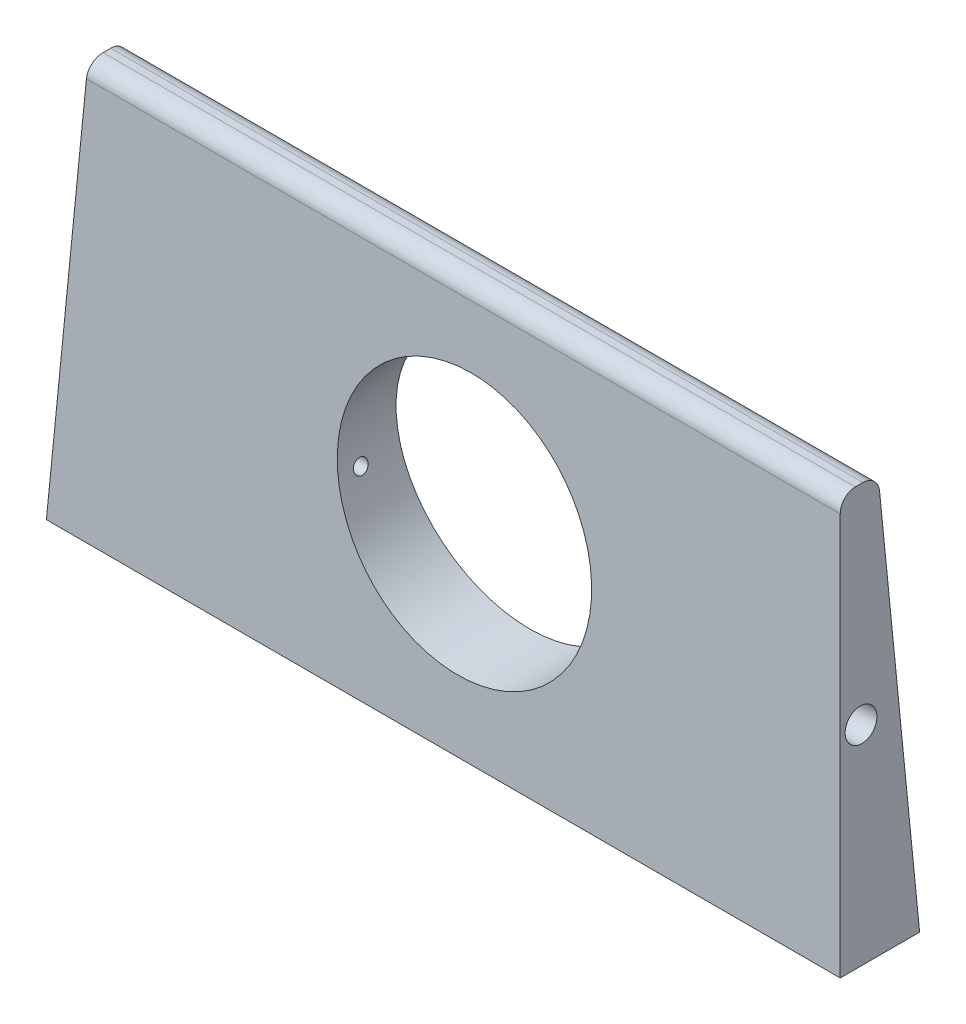
ISO-10303-21;
HEADER;
FILE_DESCRIPTION(('STEP AP214'),'2;1');
FILE_NAME('part.step','',(''),(''),'','','');
FILE_SCHEMA(('AUTOMOTIVE_DESIGN { 1 0 10303 214 1 1 1 1 }'));
ENDSEC;
DATA;
#1=APPLICATION_CONTEXT('core data for automotive mechanical design processes');
#2=APPLICATION_PROTOCOL_DEFINITION('international standard','automotive_design',2000,#1);
#3=PRODUCT_CONTEXT('',#1,'mechanical');
#4=PRODUCT('Part','Part','',(#3));
#5=PRODUCT_RELATED_PRODUCT_CATEGORY('part','',(#4));
#6=PRODUCT_DEFINITION_FORMATION('','',#4);
#7=PRODUCT_DEFINITION_CONTEXT('part definition',#1,'design');
#8=PRODUCT_DEFINITION('design','',#6,#7);
#9=PRODUCT_DEFINITION_SHAPE('','',#8);
#10=(LENGTH_UNIT() NAMED_UNIT(*) SI_UNIT(.MILLI.,.METRE.));
#11=(NAMED_UNIT(*) PLANE_ANGLE_UNIT() SI_UNIT($,.RADIAN.));
#12=(NAMED_UNIT(*) SI_UNIT($,.STERADIAN.) SOLID_ANGLE_UNIT());
#13=UNCERTAINTY_MEASURE_WITH_UNIT(LENGTH_MEASURE(1.E-05),#10,'distance_accuracy_value','');
#14=(GEOMETRIC_REPRESENTATION_CONTEXT(3) GLOBAL_UNCERTAINTY_ASSIGNED_CONTEXT((#13)) GLOBAL_UNIT_ASSIGNED_CONTEXT((#10,
#11,#12)) REPRESENTATION_CONTEXT('',''));
#15=CARTESIAN_POINT('',(0.,0.,0.));
#16=DIRECTION('',(0.,0.,1.));
#17=DIRECTION('',(1.,0.,0.));
#18=AXIS2_PLACEMENT_3D('',#15,#16,#17);
#19=CARTESIAN_POINT('',(50.,0.,-5.));
#20=DIRECTION('',(0.998629534754574,0.0523359562429438,0.));
#21=DIRECTION('',(-0.0523359562429439,0.998629534754574,0.));
#22=AXIS2_PLACEMENT_3D('',#19,#20,#21);
#23=PLANE('',#22);
#24=CARTESIAN_POINT('',(48.689805517924,25.,1.06767845664397));
#25=DIRECTION('',(0.998629534754574,0.0523359562429439,0.));
#26=DIRECTION('',(-0.0523359562429439,0.998629534754574,0.));
#27=AXIS2_PLACEMENT_3D('',#24,#25,#26);
#28=CIRCLE('',#27,2.);
#29=CARTESIAN_POINT('',(48.5851336054381,26.9972590695092,1.06767845664397));
#30=VERTEX_POINT('',#29);
#31=EDGE_CURVE('E148',#30,#30,#28,.T.);
#32=ORIENTED_EDGE('',*,*,#31,.F.);
#33=EDGE_LOOP('',(#32));
#34=FACE_BOUND('',#33,.T.);
#35=DIRECTION('',(0.0522644276887139,-0.997264688634237,-0.0522644276887139));
#36=VECTOR('',#35,1.);
#37=CARTESIAN_POINT('',(49.7268429598371,5.21214682056319,-4.72684295983712));
#38=LINE('',#37,#36);
#39=CARTESIAN_POINT('',(47.4789409719273,48.1046719124859,-2.47894097192733));
#40=VERTEX_POINT('',#39);
#41=CARTESIAN_POINT('',(50.,0.,-5.));
#42=VERTEX_POINT('',#41);
#43=EDGE_CURVE('E91',#40,#42,#38,.T.);
#44=ORIENTED_EDGE('',*,*,#43,.F.);
#45=CARTESIAN_POINT('',(47.484426594414,48.,-0.48168190241818));
#46=DIRECTION('',(0.998629534754574,0.0523359562429438,0.));
#47=DIRECTION('',(-0.0523359562429439,0.998629534754574,0.));
#48=AXIS2_PLACEMENT_3D('',#45,#46,#47);
#49=ELLIPSE('',#48,2.00274469199584,2.);
#50=CARTESIAN_POINT('',(47.379611035848,50.,-0.481681902418181));
#51=VERTEX_POINT('',#50);
#52=EDGE_CURVE('E47',#40,#51,#49,.T.);
#53=ORIENTED_EDGE('',*,*,#52,.T.);
#54=DIRECTION('',(0.,0.,1.));
#55=VECTOR('',#54,1.);
#56=CARTESIAN_POINT('',(47.379611035848,50.,-5.));
#57=LINE('',#56,#55);
#58=CARTESIAN_POINT('',(47.379611035848,50.,0.481681902418181));
#59=VERTEX_POINT('',#58);
#60=EDGE_CURVE('E121',#59,#51,#57,.F.);
#61=ORIENTED_EDGE('',*,*,#60,.F.);
#62=CARTESIAN_POINT('',(47.484426594414,48.,0.481681902418183));
#63=DIRECTION('',(0.998629534754574,0.0523359562429438,0.));
#64=DIRECTION('',(0.0523359562429439,-0.998629534754574,0.));
#65=AXIS2_PLACEMENT_3D('',#62,#63,#64);
#66=ELLIPSE('',#65,2.00274469199584,2.);
#67=CARTESIAN_POINT('',(47.4789409719273,48.1046719124859,2.47894097192733));
#68=VERTEX_POINT('',#67);
#69=EDGE_CURVE('E55',#59,#68,#66,.T.);
#70=ORIENTED_EDGE('',*,*,#69,.T.);
#71=DIRECTION('',(0.0522644276887139,-0.997264688634237,0.0522644276887139));
#72=VECTOR('',#71,1.);
#73=CARTESIAN_POINT('',(49.9726842959837,0.521214682056319,4.97268429598371));
#74=LINE('',#73,#72);
#75=CARTESIAN_POINT('',(50.,0.,5.));
#76=VERTEX_POINT('',#75);
#77=EDGE_CURVE('E109',#68,#76,#74,.T.);
#78=ORIENTED_EDGE('',*,*,#77,.T.);
#79=DIRECTION('',(0.,0.,-1.));
#80=VECTOR('',#79,1.);
#81=CARTESIAN_POINT('',(50.,0.,-5.));
#82=LINE('',#81,#80);
#83=EDGE_CURVE('E105',#76,#42,#82,.T.);
#84=ORIENTED_EDGE('',*,*,#83,.T.);
#85=EDGE_LOOP('',(#44,#53,#61,#70,#78,#84));
#86=FACE_BOUND('',#85,.T.);
#87=ADVANCED_FACE('F33',(#34,#86),#23,.T.);
#88=CARTESIAN_POINT('',(-50.,0.,-5.));
#89=DIRECTION('',(0.,0.0523359562429438,-0.998629534754574));
#90=DIRECTION('',(0.,0.998629534754574,0.0523359562429439));
#91=AXIS2_PLACEMENT_3D('',#88,#89,#90);
#92=PLANE('',#91);
#93=CARTESIAN_POINT('',(1.37682838803018,24.9657383688644,-3.69160109392641));
#94=DIRECTION('',(0.,0.0523359562429439,-0.998629534754574));
#95=DIRECTION('',(0.,0.998629534754574,0.0523359562429439));
#96=AXIS2_PLACEMENT_3D('',#93,#94,#95);
#97=CIRCLE('',#96,16.);
#98=CARTESIAN_POINT('',(1.37682838803018,40.9438109249375,-2.8542257940393));
#99=VERTEX_POINT('',#98);
#100=EDGE_CURVE('E114',#99,#99,#97,.T.);
#101=ORIENTED_EDGE('',*,*,#100,.F.);
#102=EDGE_LOOP('',(#101));
#103=FACE_BOUND('',#102,.T.);
#104=DIRECTION('',(-0.052264427688714,-0.997264688634237,-0.0522644276887139));
#105=VECTOR('',#104,1.);
#106=CARTESIAN_POINT('',(-50.,0.,-5.));
#107=LINE('',#106,#105);
#108=CARTESIAN_POINT('',(-47.4789409719273,48.1046719124859,-2.47894097192733));
#109=VERTEX_POINT('',#108);
#110=CARTESIAN_POINT('',(-50.,0.,-5.));
#111=VERTEX_POINT('',#110);
#112=EDGE_CURVE('E99',#109,#111,#107,.T.);
#113=ORIENTED_EDGE('',*,*,#112,.F.);
#114=DIRECTION('',(-1.,0.,0.));
#115=VECTOR('',#114,1.);
#116=CARTESIAN_POINT('',(47.3796110358479,48.1046719124859,-2.47894097192733));
#117=LINE('',#116,#115);
#118=EDGE_CURVE('E63',#109,#40,#117,.F.);
#119=ORIENTED_EDGE('',*,*,#118,.T.);
#120=ORIENTED_EDGE('',*,*,#43,.T.);
#121=DIRECTION('',(-1.,0.,0.));
#122=VECTOR('',#121,1.);
#123=CARTESIAN_POINT('',(-50.,0.,-5.));
#124=LINE('',#123,#122);
#125=EDGE_CURVE('E94',#42,#111,#124,.T.);
#126=ORIENTED_EDGE('',*,*,#125,.T.);
#127=EDGE_LOOP('',(#113,#119,#120,#126));
#128=FACE_BOUND('',#127,.T.);
#129=ADVANCED_FACE('F93',(#103,#128),#92,.T.);
#130=CARTESIAN_POINT('',(-50.,0.,-5.));
#131=DIRECTION('',(-0.998629534754574,0.0523359562429438,0.));
#132=DIRECTION('',(-0.0523359562429439,-0.998629534754574,0.));
#133=AXIS2_PLACEMENT_3D('',#130,#131,#132);
#134=PLANE('',#133);
#135=CARTESIAN_POINT('',(-48.9579742705038,19.8830353766459,1.06767845664397));
#136=DIRECTION('',(-0.998629534754574,0.0523359562429438,0.));
#137=DIRECTION('',(0.0523359562429438,0.998629534754574,0.));
#138=AXIS2_PLACEMENT_3D('',#135,#136,#137);
#139=ELLIPSE('',#138,0.29482816245339,0.293212569488019);
#140=CARTESIAN_POINT('',(-48.9425441566945,20.1774594873492,1.06767845664397));
#141=VERTEX_POINT('',#140);
#142=EDGE_CURVE('E271',#141,#141,#139,.F.);
#143=ORIENTED_EDGE('',*,*,#142,.T.);
#144=EDGE_LOOP('',(#143));
#145=FACE_BOUND('',#144,.T.);
#146=DIRECTION('',(0.,0.,-1.));
#147=VECTOR('',#146,1.);
#148=CARTESIAN_POINT('',(-47.3796110358479,50.,-5.));
#149=LINE('',#148,#147);
#150=CARTESIAN_POINT('',(-47.3796110358479,50.,-0.481681902418181));
#151=VERTEX_POINT('',#150);
#152=CARTESIAN_POINT('',(-47.3796110358479,50.,0.481681902418181));
#153=VERTEX_POINT('',#152);
#154=EDGE_CURVE('E125',#151,#153,#149,.F.);
#155=ORIENTED_EDGE('',*,*,#154,.F.);
#156=CARTESIAN_POINT('',(-47.484426594414,48.,-0.48168190241818));
#157=DIRECTION('',(-0.998629534754574,0.0523359562429438,0.));
#158=DIRECTION('',(-0.0523359562429439,-0.998629534754574,0.));
#159=AXIS2_PLACEMENT_3D('',#156,#157,#158);
#160=ELLIPSE('',#159,2.00274469199584,2.);
#161=EDGE_CURVE('E139',#151,#109,#160,.T.);
#162=ORIENTED_EDGE('',*,*,#161,.T.);
#163=ORIENTED_EDGE('',*,*,#112,.T.);
#164=DIRECTION('',(0.,0.,1.));
#165=VECTOR('',#164,1.);
#166=CARTESIAN_POINT('',(-50.,0.,-5.));
#167=LINE('',#166,#165);
#168=CARTESIAN_POINT('',(-50.,0.,5.));
#169=VERTEX_POINT('',#168);
#170=EDGE_CURVE('E107',#111,#169,#167,.T.);
#171=ORIENTED_EDGE('',*,*,#170,.T.);
#172=DIRECTION('',(-0.0522644276887139,-0.997264688634237,0.0522644276887139));
#173=VECTOR('',#172,1.);
#174=CARTESIAN_POINT('',(-50.,0.,5.));
#175=LINE('',#174,#173);
#176=CARTESIAN_POINT('',(-47.4789409719273,48.1046719124859,2.47894097192733));
#177=VERTEX_POINT('',#176);
#178=EDGE_CURVE('E124',#177,#169,#175,.T.);
#179=ORIENTED_EDGE('',*,*,#178,.F.);
#180=CARTESIAN_POINT('',(-47.484426594414,48.,0.481681902418183));
#181=DIRECTION('',(-0.998629534754574,0.0523359562429438,0.));
#182=DIRECTION('',(0.0523359562429439,0.998629534754574,0.));
#183=AXIS2_PLACEMENT_3D('',#180,#181,#182);
#184=ELLIPSE('',#183,2.00274469199584,2.);
#185=EDGE_CURVE('E137',#177,#153,#184,.T.);
#186=ORIENTED_EDGE('',*,*,#185,.T.);
#187=EDGE_LOOP('',(#155,#162,#163,#171,#179,#186));
#188=FACE_BOUND('',#187,.T.);
#189=ADVANCED_FACE('F170',(#145,#188),#134,.T.);
#190=CARTESIAN_POINT('',(-50.,0.,5.));
#191=DIRECTION('',(0.,0.0523359562429438,0.998629534754574));
#192=DIRECTION('',(0.,-0.998629534754574,0.0523359562429439));
#193=AXIS2_PLACEMENT_3D('',#190,#191,#192);
#194=PLANE('',#193);
#195=CARTESIAN_POINT('',(1.37682838803018,24.5777354589813,3.71193546478874));
#196=DIRECTION('',(0.,0.0523359562429438,0.998629534754574));
#197=DIRECTION('',(0.,0.998629534754574,-0.0523359562429439));
#198=AXIS2_PLACEMENT_3D('',#195,#196,#197);
#199=ELLIPSE('',#198,16.0881324730163,16.);
#200=CARTESIAN_POINT('',(1.37682838803018,40.6438197055795,2.86994766765027));
#201=VERTEX_POINT('',#200);
#202=EDGE_CURVE('E111',#201,#201,#199,.F.);
#203=ORIENTED_EDGE('',*,*,#202,.T.);
#204=EDGE_LOOP('',(#203));
#205=FACE_BOUND('',#204,.T.);
#206=ORIENTED_EDGE('',*,*,#77,.F.);
#207=DIRECTION('',(1.,0.,0.));
#208=VECTOR('',#207,1.);
#209=CARTESIAN_POINT('',(-47.3796110358479,48.1046719124859,2.47894097192733));
#210=LINE('',#209,#208);
#211=EDGE_CURVE('E11',#68,#177,#210,.F.);
#212=ORIENTED_EDGE('',*,*,#211,.T.);
#213=ORIENTED_EDGE('',*,*,#178,.T.);
#214=DIRECTION('',(1.,0.,0.));
#215=VECTOR('',#214,1.);
#216=CARTESIAN_POINT('',(-50.,0.,5.));
#217=LINE('',#216,#215);
#218=EDGE_CURVE('E120',#169,#76,#217,.T.);
#219=ORIENTED_EDGE('',*,*,#218,.T.);
#220=EDGE_LOOP('',(#206,#212,#213,#219));
#221=FACE_BOUND('',#220,.T.);
#222=ADVANCED_FACE('F176',(#205,#221),#194,.T.);
#223=CARTESIAN_POINT('',(0.,50.,0.));
#224=DIRECTION('',(0.,1.,0.));
#225=DIRECTION('',(0.,0.,1.));
#226=AXIS2_PLACEMENT_3D('',#223,#224,#225);
#227=PLANE('',#226);
#228=ORIENTED_EDGE('',*,*,#60,.T.);
#229=DIRECTION('',(1.,0.,0.));
#230=VECTOR('',#229,1.);
#231=CARTESIAN_POINT('',(-47.3796110358479,50.,-0.48168190241818));
#232=LINE('',#231,#230);
#233=EDGE_CURVE('E134',#51,#151,#232,.F.);
#234=ORIENTED_EDGE('',*,*,#233,.T.);
#235=ORIENTED_EDGE('',*,*,#154,.T.);
#236=DIRECTION('',(-1.,0.,0.));
#237=VECTOR('',#236,1.);
#238=CARTESIAN_POINT('',(47.3796110358479,50.,0.481681902418183));
#239=LINE('',#238,#237);
#240=EDGE_CURVE('E98',#153,#59,#239,.F.);
#241=ORIENTED_EDGE('',*,*,#240,.T.);
#242=EDGE_LOOP('',(#228,#234,#235,#241));
#243=FACE_BOUND('',#242,.T.);
#244=ADVANCED_FACE('F179',(#243),#227,.T.);
#245=CARTESIAN_POINT('',(0.,0.,0.));
#246=DIRECTION('',(0.,1.,0.));
#247=DIRECTION('',(0.,0.,1.));
#248=AXIS2_PLACEMENT_3D('',#245,#246,#247);
#249=PLANE('',#248);
#250=ORIENTED_EDGE('',*,*,#83,.F.);
#251=ORIENTED_EDGE('',*,*,#218,.F.);
#252=ORIENTED_EDGE('',*,*,#170,.F.);
#253=ORIENTED_EDGE('',*,*,#125,.F.);
#254=EDGE_LOOP('',(#250,#251,#252,#253));
#255=FACE_BOUND('',#254,.T.);
#256=ADVANCED_FACE('F103',(#255),#249,.F.);
#257=CARTESIAN_POINT('',(0.,48.,-0.48168190241818));
#258=DIRECTION('',(-1.,0.,0.));
#259=DIRECTION('',(0.,0.,1.));
#260=AXIS2_PLACEMENT_3D('',#257,#258,#259);
#261=CYLINDRICAL_SURFACE('',#260,2.);
#262=ORIENTED_EDGE('',*,*,#52,.F.);
#263=ORIENTED_EDGE('',*,*,#118,.F.);
#264=ORIENTED_EDGE('',*,*,#161,.F.);
#265=ORIENTED_EDGE('',*,*,#233,.F.);
#266=EDGE_LOOP('',(#262,#263,#264,#265));
#267=FACE_BOUND('',#266,.T.);
#268=ADVANCED_FACE('F183',(#267),#261,.T.);
#269=CARTESIAN_POINT('',(0.,48.,0.481681902418183));
#270=DIRECTION('',(1.,0.,0.));
#271=DIRECTION('',(0.,0.,-1.));
#272=AXIS2_PLACEMENT_3D('',#269,#270,#271);
#273=CYLINDRICAL_SURFACE('',#272,2.);
#274=ORIENTED_EDGE('',*,*,#185,.F.);
#275=ORIENTED_EDGE('',*,*,#211,.F.);
#276=ORIENTED_EDGE('',*,*,#69,.F.);
#277=ORIENTED_EDGE('',*,*,#240,.F.);
#278=EDGE_LOOP('',(#274,#275,#276,#277));
#279=FACE_BOUND('',#278,.T.);
#280=ADVANCED_FACE('F35',(#279),#273,.T.);
#281=CARTESIAN_POINT('',(1.37682838803018,22.3489405567172,46.2398756438023));
#282=DIRECTION('',(0.,0.0523359562429439,-0.998629534754574));
#283=DIRECTION('',(0.,0.998629534754574,0.0523359562429439));
#284=AXIS2_PLACEMENT_3D('',#281,#282,#283);
#285=CYLINDRICAL_SURFACE('',#284,16.);
#286=CARTESIAN_POINT('',(-14.2053097358546,21.1142489351445,0.386808872090175));
#287=CARTESIAN_POINT('',(-14.1969729767099,21.0767306769678,0.419439614491833));
#288=CARTESIAN_POINT('',(-14.1891609798738,21.0418564849322,0.455294496951633));
#289=CARTESIAN_POINT('',(-14.1749392554387,20.9784224811121,0.532501080775057));
#290=CARTESIAN_POINT('',(-14.1685309274257,20.9498689713266,0.573858202942392));
#291=CARTESIAN_POINT('',(-14.1574259566168,20.8999463260445,0.660935278960941));
#292=CARTESIAN_POINT('',(-14.1527297831173,20.8785791604275,0.706656424651415));
#293=CARTESIAN_POINT('',(-14.1452895682051,20.8437082415495,0.801143188514748));
#294=CARTESIAN_POINT('',(-14.1425450022963,20.8302023757348,0.84990798486876));
#295=CARTESIAN_POINT('',(-14.13916880299,20.8115806384595,0.94848076844885));
#296=CARTESIAN_POINT('',(-14.1385123515315,20.8063665910857,0.998269368458249));
#297=CARTESIAN_POINT('',(-14.1392758193527,20.8041756801189,1.09801129271629));
#298=CARTESIAN_POINT('',(-14.1406957100088,20.8071987029741,1.14796461468468));
#299=CARTESIAN_POINT('',(-14.1455221631721,20.8213295093836,1.24628296443282));
#300=CARTESIAN_POINT('',(-14.1489158722734,20.8323851002803,1.2946561492486));
#301=CARTESIAN_POINT('',(-14.1575106499339,20.862173937677,1.38880610451745));
#302=CARTESIAN_POINT('',(-14.162711780389,20.8809074471146,1.43458278598973));
#303=CARTESIAN_POINT('',(-14.1747273825481,20.9256897603826,1.52269353631986));
#304=CARTESIAN_POINT('',(-14.1815557905613,20.9518021384935,1.56499336919618));
#305=CARTESIAN_POINT('',(-14.1964894775306,21.0105117581483,1.64456776471199));
#306=CARTESIAN_POINT('',(-14.2045948698183,21.0431095753381,1.68184188077695));
#307=CARTESIAN_POINT('',(-14.2218858246406,21.1144918865355,1.7509867372724));
#308=CARTESIAN_POINT('',(-14.2310875460225,21.1533730074497,1.78275369744826));
#309=CARTESIAN_POINT('',(-14.25008254097,21.2358243383302,1.83924612353742));
#310=CARTESIAN_POINT('',(-14.259875861755,21.279394922812,1.86397102647359));
#311=CARTESIAN_POINT('',(-14.2798191231954,21.3706311117665,1.9059921368138));
#312=CARTESIAN_POINT('',(-14.2899720558541,21.4183429108857,1.92318671133043));
#313=CARTESIAN_POINT('',(-14.3101569021754,21.5160268616124,1.94918027532786));
#314=CARTESIAN_POINT('',(-14.3201888134896,21.5659990569938,1.95797910214663));
#315=CARTESIAN_POINT('',(-14.3398371044744,21.6668927555146,1.96691460392223));
#316=CARTESIAN_POINT('',(-14.3494526708185,21.7178158611337,1.96703502682289));
#317=CARTESIAN_POINT('',(-14.3679840214831,21.8190560634574,1.95852806859943));
#318=CARTESIAN_POINT('',(-14.3768998297319,21.869373180834,1.94990098673767));
#319=CARTESIAN_POINT('',(-14.3937655469288,21.9675802948413,1.92419527109203));
#320=CARTESIAN_POINT('',(-14.4017218244924,22.015484906209,1.90717667161143));
#321=CARTESIAN_POINT('',(-14.4165959852007,22.1078349460281,1.86516652957016));
#322=CARTESIAN_POINT('',(-14.4235139180996,22.1522805401747,1.84017536920715));
#323=CARTESIAN_POINT('',(-14.4361630352348,22.2360117816903,1.78317093677869));
#324=CARTESIAN_POINT('',(-14.4419042594883,22.2753399385222,1.75122232309396));
#325=CARTESIAN_POINT('',(-14.4522308269859,22.348135013272,1.68107249785172));
#326=CARTESIAN_POINT('',(-14.4568162092876,22.3816021292313,1.6428714976434));
#327=CARTESIAN_POINT('',(-14.4647920583809,22.4414989339322,1.561554114536));
#328=CARTESIAN_POINT('',(-14.4681896123566,22.4679701241959,1.51846898966259));
#329=CARTESIAN_POINT('',(-14.4738319625919,22.5133638912345,1.42842120437397));
#330=CARTESIAN_POINT('',(-14.4760767781177,22.5322865941688,1.38145860877951));
#331=CARTESIAN_POINT('',(-14.4794189192814,22.561987666245,1.2851284848764));
#332=CARTESIAN_POINT('',(-14.4805193840929,22.5727882931187,1.23576792658477));
#333=CARTESIAN_POINT('',(-14.4815909389736,22.5860175258618,1.13592547975633));
#334=CARTESIAN_POINT('',(-14.4815620357457,22.5884461814189,1.08544359787638));
#335=CARTESIAN_POINT('',(-14.4803752151042,22.584864929351,0.984830425730024));
#336=CARTESIAN_POINT('',(-14.4792181178205,22.5788611502068,0.934698907431312));
#337=CARTESIAN_POINT('',(-14.4757689180597,22.5586051696089,0.836171765162234));
#338=CARTESIAN_POINT('',(-14.4734768187519,22.5443529911872,0.78777613634515));
#339=CARTESIAN_POINT('',(-14.4677467890628,22.5080120678449,0.694069015073803));
#340=CARTESIAN_POINT('',(-14.4643083207183,22.4859196433726,0.64875898265972));
#341=CARTESIAN_POINT('',(-14.4562829994474,22.4345495103104,0.562526936735176));
#342=CARTESIAN_POINT('',(-14.4516961417995,22.4052717721781,0.521604941267028));
#343=CARTESIAN_POINT('',(-14.441379695853,22.3403282154806,0.445223587633654));
#344=CARTESIAN_POINT('',(-14.4356479910928,22.3046505781571,0.409774565724605));
#345=CARTESIAN_POINT('',(-14.4230933171212,22.2279870057031,0.345413834749294));
#346=CARTESIAN_POINT('',(-14.4162703290054,22.1870009786182,0.316502238951249));
#347=CARTESIAN_POINT('',(-14.4015891292395,22.1007198181809,0.26589159406264));
#348=CARTESIAN_POINT('',(-14.3937265696606,22.055406821844,0.244224266401464));
#349=CARTESIAN_POINT('',(-14.3771289260921,21.9619268214094,0.208848311032689));
#350=CARTESIAN_POINT('',(-14.3683938416551,21.9137598158479,0.195139687406788));
#351=CARTESIAN_POINT('',(-14.3501781188323,21.8155722877493,0.175952825506026));
#352=CARTESIAN_POINT('',(-14.3406924883928,21.7655407734536,0.170535604306719));
#353=CARTESIAN_POINT('',(-14.3212822119016,21.6653536839896,0.16824010905577));
#354=CARTESIAN_POINT('',(-14.3113574401651,21.6151980772338,0.17136429536073));
#355=CARTESIAN_POINT('',(-14.2912859140298,21.5157298383209,0.186109167390821));
#356=CARTESIAN_POINT('',(-14.2811379732042,21.4664285655171,0.197804659542959));
#357=CARTESIAN_POINT('',(-14.2610643744166,21.3705412360892,0.229440982132198));
#358=CARTESIAN_POINT('',(-14.2511384865333,21.3239522824985,0.249372824081264));
#359=CARTESIAN_POINT('',(-14.2351451027115,21.2498755517934,0.288859983939628));
#360=CARTESIAN_POINT('',(-14.2289078836465,21.2212559987493,0.306263452258325));
#361=CARTESIAN_POINT('',(-14.2168039823362,21.1661056686969,0.344224522649726));
#362=CARTESIAN_POINT('',(-14.2109373009463,21.13957489651,0.364782132002756));
#363=CARTESIAN_POINT('',(-14.2053097358546,21.1142489351445,0.386808872090175));
#364=B_SPLINE_CURVE_WITH_KNOTS('',3,(#286,#287,#288,#289,#290,#291,#292,#293,#294,#295,#296,
#297,#298,#299,#300,#301,#302,#303,#304,#305,#306,#307,#308,#309,#310,#311,#312,#313,#314,#315,
#316,#317,#318,#319,#320,#321,#322,#323,#324,#325,#326,#327,#328,#329,#330,#331,#332,#333,#334,
#335,#336,#337,#338,#339,#340,#341,#342,#343,#344,#345,#346,#347,#348,#349,#350,#351,#352,#353,
#354,#355,#356,#357,#358,#359,#360,#361,#362,#363),.UNSPECIFIED.,.T.,.F.,(4,2,2,2,2,2,2,2,2,2,2,
2,2,2,2,2,2,2,2,2,2,2,2,2,2,2,2,2,2,2,2,2,2,2,2,2,2,2,4),(0.,0.151130020752967,
0.302410052815269,0.453731519165145,0.60501230236012,0.754488202651457,0.903962042359312,
1.05247324435255,1.20098953267468,1.35082659582126,1.50067696440859,1.65310061255814,
1.80553644279483,1.95997057782597,2.1144077048551,2.26913403895384,2.42385507986239,
2.57748493905007,2.73110743446163,2.88335894480901,3.03560530966663,3.18692713887169,
3.33824643889971,3.48914953713617,3.64005173976023,3.79084432720375,3.94163649359166,
4.09249952292608,4.24336317254094,4.39450834679323,4.54565613960402,4.69745737025989,
4.84925867876843,5.00217182307907,5.15512901873601,5.30943729622037,5.46357761697848,
5.5655947259291,5.66761207035711),.UNSPECIFIED.);
#365=CARTESIAN_POINT('',(-14.2053097358546,21.1142489351445,0.386808872090175));
#366=VERTEX_POINT('',#365);
#367=EDGE_CURVE('E37',#366,#366,#364,.T.);
#368=ORIENTED_EDGE('',*,*,#367,.T.);
#369=EDGE_LOOP('',(#368));
#370=FACE_BOUND('',#369,.T.);
#371=CARTESIAN_POINT('',(17.243802826328,22.7230565406934,-0.238994867252208));
#372=CARTESIAN_POINT('',(17.2532204109005,22.7976145455135,-0.274799976111302));
#373=CARTESIAN_POINT('',(17.2625711930805,22.8752608004769,-0.304324303466473));
#374=CARTESIAN_POINT('',(17.2806303397654,23.0345455875491,-0.349931138548202));
#375=CARTESIAN_POINT('',(17.2893379629585,23.1161885515672,-0.365998349295277));
#376=CARTESIAN_POINT('',(17.3057035044729,23.2811248026026,-0.384143145455335));
#377=CARTESIAN_POINT('',(17.3133614868505,23.3644179885567,-0.386221584932156));
#378=CARTESIAN_POINT('',(17.327355390481,23.5302447021713,-0.376238058836334));
#379=CARTESIAN_POINT('',(17.3336916933503,23.6127784425136,-0.36418018160196));
#380=CARTESIAN_POINT('',(17.344876810847,23.7740500942195,-0.326338531279177));
#381=CARTESIAN_POINT('',(17.3497370239496,23.8528129184449,-0.300664374355026));
#382=CARTESIAN_POINT('',(17.358058964793,24.0049219233619,-0.236321336572888));
#383=CARTESIAN_POINT('',(17.3615207164366,24.0782681966165,-0.19765267783964));
#384=CARTESIAN_POINT('',(17.3671622621919,24.2166002677239,-0.108887695623013));
#385=CARTESIAN_POINT('',(17.3693556845828,24.2816688515138,-0.0589212017546873));
#386=CARTESIAN_POINT('',(17.3727532364741,24.4024822414306,0.0512643365918627));
#387=CARTESIAN_POINT('',(17.3739573943888,24.4582273153186,0.111483086536207));
#388=CARTESIAN_POINT('',(17.3756569988459,24.5585627457928,0.240175302208014));
#389=CARTESIAN_POINT('',(17.3761554898023,24.6032003307142,0.308611917716892));
#390=CARTESIAN_POINT('',(17.3767394571855,24.6803652696987,0.452003541651508));
#391=CARTESIAN_POINT('',(17.376824933514,24.7128926208791,0.526958551628983));
#392=CARTESIAN_POINT('',(17.3768316636616,24.7649353336299,0.681304010683619));
#393=CARTESIAN_POINT('',(17.3767528247513,24.7844433396876,0.760696939640771));
#394=CARTESIAN_POINT('',(17.3766074440072,24.809873017427,0.921629843586136));
#395=CARTESIAN_POINT('',(17.3765409022781,24.815794573388,1.0031698368557));
#396=CARTESIAN_POINT('',(17.3764998303003,24.8138865715525,1.16619687250302));
#397=CARTESIAN_POINT('',(17.376525421709,24.8060388390757,1.24768370265906));
#398=CARTESIAN_POINT('',(17.3766405981859,24.7767791941808,1.40818479392585));
#399=CARTESIAN_POINT('',(17.3767301834501,24.7553672402017,1.48719904745978));
#400=CARTESIAN_POINT('',(17.3768405277492,24.6995732961587,1.64053646612389));
#401=CARTESIAN_POINT('',(17.3768612648315,24.6651871731167,1.71485812759231));
#402=CARTESIAN_POINT('',(17.3766145721036,24.5844181194968,1.85666807524751));
#403=CARTESIAN_POINT('',(17.3763471441984,24.5380352682235,1.92415640660203));
#404=CARTESIAN_POINT('',(17.3752497801165,24.4346330802335,2.0503298054116));
#405=CARTESIAN_POINT('',(17.3744202799471,24.3776220127987,2.10902165335577));
#406=CARTESIAN_POINT('',(17.3719095741331,24.2545726596775,2.21600032383517));
#407=CARTESIAN_POINT('',(17.3702283814253,24.1885345111175,2.26428730439757));
#408=CARTESIAN_POINT('',(17.3657550746872,24.0493884137547,2.34906953918062));
#409=CARTESIAN_POINT('',(17.3629638674241,23.9762862723118,2.38557437420963));
#410=CARTESIAN_POINT('',(17.3560810926607,23.8250692215206,2.44585466021473));
#411=CARTESIAN_POINT('',(17.3519895220354,23.746954300126,2.46963008059904));
#412=CARTESIAN_POINT('',(17.3424101327225,23.5877415948927,2.50389139940615));
#413=CARTESIAN_POINT('',(17.3369188313147,23.5066368088289,2.51434375318189));
#414=CARTESIAN_POINT('',(17.3245895933196,23.343920779184,2.52164079626804));
#415=CARTESIAN_POINT('',(17.3177515933358,23.2623095119353,2.51848484481298));
#416=CARTESIAN_POINT('',(17.3028445531368,23.1001294751147,2.49864903711832));
#417=CARTESIAN_POINT('',(17.2947652210045,23.0195761733926,2.48185055680586));
#418=CARTESIAN_POINT('',(17.2777391334197,22.8624720541708,2.43511145180348));
#419=CARTESIAN_POINT('',(17.2687923099432,22.7859215512748,2.40516979584527));
#420=CARTESIAN_POINT('',(17.2503629590832,22.6380911093681,2.33258927307034));
#421=CARTESIAN_POINT('',(17.240875582131,22.5668792211326,2.28981295658324));
#422=CARTESIAN_POINT('',(17.2219950218931,22.4326705333605,2.19286151962063));
#423=CARTESIAN_POINT('',(17.212601842299,22.3696740546333,2.13868595422364));
#424=CARTESIAN_POINT('',(17.1944815829701,22.2535885664399,2.02027363520592));
#425=CARTESIAN_POINT('',(17.185755882754,22.2005197645965,1.95601683959685));
#426=CARTESIAN_POINT('',(17.1695922808097,22.1060576002374,1.81928009701056));
#427=CARTESIAN_POINT('',(17.162154276555,22.0646633080304,1.74680080547103));
#428=CARTESIAN_POINT('',(17.1492127624669,21.9953965551382,1.59678665493861));
#429=CARTESIAN_POINT('',(17.1436823487481,21.967333737029,1.51934208537014));
#430=CARTESIAN_POINT('',(17.1348291636412,21.9247757233342,1.36069101526742));
#431=CARTESIAN_POINT('',(17.1315060600972,21.9102784862677,1.27948508271081));
#432=CARTESIAN_POINT('',(17.1273775092567,21.8955289402826,1.11756078236171));
#433=CARTESIAN_POINT('',(17.1265174936518,21.8949657361972,1.03687202687558));
#434=CARTESIAN_POINT('',(17.1272248653912,21.9073279541567,0.876552282243919));
#435=CARTESIAN_POINT('',(17.1287919875789,21.9202519027265,0.796921178512076));
#436=CARTESIAN_POINT('',(17.134203793771,21.9589742713275,0.641775966409045));
#437=CARTESIAN_POINT('',(17.1380259494917,21.9846449523276,0.566229095439057));
#438=CARTESIAN_POINT('',(17.1476470735803,22.047999550407,0.420470181683676));
#439=CARTESIAN_POINT('',(17.1534465956429,22.0856868321384,0.350259639898907));
#440=CARTESIAN_POINT('',(17.1666942282323,22.1724767677361,0.216212349104659));
#441=CARTESIAN_POINT('',(17.1741621048887,22.221716677518,0.152466594231707));
#442=CARTESIAN_POINT('',(17.1901908158487,22.3298853873946,0.0340567609539091));
#443=CARTESIAN_POINT('',(17.1987506010165,22.3888049024988,-0.0206159205836691));
#444=CARTESIAN_POINT('',(17.2134781252298,22.4937129804098,-0.103071306123446));
#445=CARTESIAN_POINT('',(17.2194943749061,22.5374831320026,-0.133749065986993));
#446=CARTESIAN_POINT('',(17.2316173014361,22.6280920936081,-0.190155190036062));
#447=CARTESIAN_POINT('',(17.2377239802294,22.6749309695093,-0.215883447904096));
#448=CARTESIAN_POINT('',(17.243802826328,22.7230565406934,-0.238994867252208));
#449=B_SPLINE_CURVE_WITH_KNOTS('',3,(#371,#372,#373,#374,#375,#376,#377,#378,#379,#380,#381,
#382,#383,#384,#385,#386,#387,#388,#389,#390,#391,#392,#393,#394,#395,#396,#397,#398,#399,#400,
#401,#402,#403,#404,#405,#406,#407,#408,#409,#410,#411,#412,#413,#414,#415,#416,#417,#418,#419,
#420,#421,#422,#423,#424,#425,#426,#427,#428,#429,#430,#431,#432,#433,#434,#435,#436,#437,#438,
#439,#440,#441,#442,#443,#444,#445,#446,#447,#448),.UNSPECIFIED.,.T.,.F.,(4,2,2,2,2,2,2,2,2,2,2,
2,2,2,2,2,2,2,2,2,2,2,2,2,2,2,2,2,2,2,2,2,2,2,2,2,2,2,4),(0.,0.249538542733493,0.49936035752835,
0.749166919681693,0.998901253555167,1.24665498687251,1.49440448536541,1.7394399114409,
1.98446829915727,2.22843632082797,2.47240440057671,2.71651019805241,2.96061807465908,
3.20504840226802,3.449479478822,3.69398848579242,3.93849587647356,4.18281381623655,
4.42712804508287,4.6712431030831,4.91535874774644,5.16008781738636,5.40482841055177,
5.6517201425435,5.89863125015242,6.14828716998416,6.397952835887,6.64812129044348,
6.89826981738047,7.14473035655599,7.39115379997659,7.63207397972087,7.8729678416231,
8.11149492514576,8.350088855066,8.59167551705485,8.83303178007037,8.9941000248851,
9.15517172913061),.UNSPECIFIED.);
#450=CARTESIAN_POINT('',(17.243802826328,22.7230565406934,-0.238994867252208));
#451=VERTEX_POINT('',#450);
#452=EDGE_CURVE('E143',#451,#451,#449,.T.);
#453=ORIENTED_EDGE('',*,*,#452,.T.);
#454=EDGE_LOOP('',(#453));
#455=FACE_BOUND('',#454,.T.);
#456=ORIENTED_EDGE('',*,*,#100,.T.);
#457=EDGE_LOOP('',(#456));
#458=FACE_BOUND('',#457,.T.);
#459=ORIENTED_EDGE('',*,*,#202,.F.);
#460=EDGE_LOOP('',(#459));
#461=FACE_BOUND('',#460,.T.);
#462=ADVANCED_FACE('F149',(#370,#455,#458,#461),#285,.F.);
#463=CARTESIAN_POINT('',(48.689805517924,25.,1.06767845664397));
#464=DIRECTION('',(0.998629534754574,0.0523359562429439,0.));
#465=DIRECTION('',(-0.0523359562429439,0.998629534754574,0.));
#466=AXIS2_PLACEMENT_3D('',#463,#464,#465);
#467=CONICAL_SURFACE('',#466,2.,0.0174532925199433);
#468=ORIENTED_EDGE('',*,*,#31,.T.);
#469=EDGE_LOOP('',(#468));
#470=FACE_BOUND('',#469,.T.);
#471=ORIENTED_EDGE('',*,*,#452,.F.);
#472=EDGE_LOOP('',(#471));
#473=FACE_BOUND('',#472,.T.);
#474=ADVANCED_FACE('F155',(#470,#473),#467,.F.);
#475=ORIENTED_EDGE('',*,*,#367,.F.);
#476=EDGE_LOOP('',(#475));
#477=FACE_BOUND('',#476,.T.);
#478=ORIENTED_EDGE('',*,*,#142,.F.);
#479=EDGE_LOOP('',(#478));
#480=FACE_BOUND('',#479,.T.);
#481=ADVANCED_FACE('F152',(#477,#480),#467,.F.);
#482=CLOSED_SHELL('',(#87,#129,#189,#222,#244,#256,#268,#280,#462,#474,#481));
#483=MANIFOLD_SOLID_BREP('B2',#482);
#484=ADVANCED_BREP_SHAPE_REPRESENTATION('',(#18,#483),#14);
#485=SHAPE_DEFINITION_REPRESENTATION(#9,#484);
ENDSEC;
END-ISO-10303-21;
